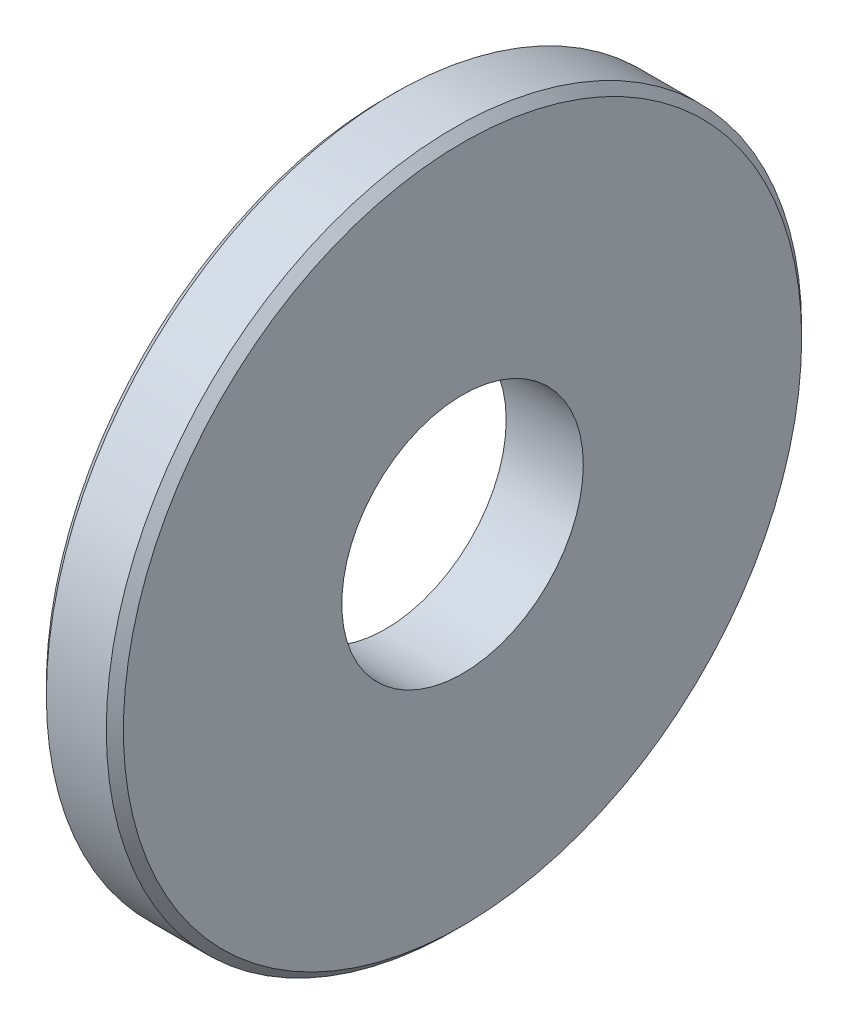
ISO-10303-21;
HEADER;
FILE_DESCRIPTION(('STEP AP214'),'2;1');
FILE_NAME('part.step','',(''),(''),'','','');
FILE_SCHEMA(('AUTOMOTIVE_DESIGN { 1 0 10303 214 1 1 1 1 }'));
ENDSEC;
DATA;
#1=APPLICATION_CONTEXT('core data for automotive mechanical design processes');
#2=APPLICATION_PROTOCOL_DEFINITION('international standard','automotive_design',2000,#1);
#3=PRODUCT_CONTEXT('',#1,'mechanical');
#4=PRODUCT('Part','Part','',(#3));
#5=PRODUCT_RELATED_PRODUCT_CATEGORY('part','',(#4));
#6=PRODUCT_DEFINITION_FORMATION('','',#4);
#7=PRODUCT_DEFINITION_CONTEXT('part definition',#1,'design');
#8=PRODUCT_DEFINITION('design','',#6,#7);
#9=PRODUCT_DEFINITION_SHAPE('','',#8);
#10=(LENGTH_UNIT() NAMED_UNIT(*) SI_UNIT(.MILLI.,.METRE.));
#11=(NAMED_UNIT(*) PLANE_ANGLE_UNIT() SI_UNIT($,.RADIAN.));
#12=(NAMED_UNIT(*) SI_UNIT($,.STERADIAN.) SOLID_ANGLE_UNIT());
#13=UNCERTAINTY_MEASURE_WITH_UNIT(LENGTH_MEASURE(1.E-05),#10,'distance_accuracy_value','');
#14=(GEOMETRIC_REPRESENTATION_CONTEXT(3) GLOBAL_UNCERTAINTY_ASSIGNED_CONTEXT((#13)) GLOBAL_UNIT_ASSIGNED_CONTEXT((#10,
#11,#12)) REPRESENTATION_CONTEXT('',''));
#15=CARTESIAN_POINT('',(0.,0.,0.));
#16=DIRECTION('',(0.,0.,1.));
#17=DIRECTION('',(1.,0.,0.));
#18=AXIS2_PLACEMENT_3D('',#15,#16,#17);
#19=CARTESIAN_POINT('',(1.143,0.,0.));
#20=DIRECTION('',(1.,0.,0.));
#21=DIRECTION('',(0.,0.,-1.));
#22=AXIS2_PLACEMENT_3D('',#19,#20,#21);
#23=PLANE('',#22);
#24=CARTESIAN_POINT('',(1.143,0.,0.));
#25=DIRECTION('',(1.,0.,0.));
#26=DIRECTION('',(0.,0.,-1.));
#27=AXIS2_PLACEMENT_3D('',#24,#25,#26);
#28=CIRCLE('',#27,5.0292);
#29=CARTESIAN_POINT('',(1.143,0.,-5.0292));
#30=VERTEX_POINT('',#29);
#31=EDGE_CURVE('E53',#30,#30,#28,.T.);
#32=ORIENTED_EDGE('',*,*,#31,.T.);
#33=EDGE_LOOP('',(#32));
#34=FACE_BOUND('',#33,.T.);
#35=CARTESIAN_POINT('',(1.143,0.,0.));
#36=DIRECTION('',(1.,0.,0.));
#37=DIRECTION('',(0.,0.,-1.));
#38=AXIS2_PLACEMENT_3D('',#35,#36,#37);
#39=CIRCLE('',#38,1.7907);
#40=CARTESIAN_POINT('',(1.143,0.,-1.7907));
#41=VERTEX_POINT('',#40);
#42=EDGE_CURVE('E58',#41,#41,#39,.T.);
#43=ORIENTED_EDGE('',*,*,#42,.F.);
#44=EDGE_LOOP('',(#43));
#45=FACE_BOUND('',#44,.T.);
#46=ADVANCED_FACE('F37',(#34,#45),#23,.T.);
#47=CARTESIAN_POINT('',(0.,0.,0.));
#48=DIRECTION('',(1.,0.,0.));
#49=DIRECTION('',(0.,0.,-1.));
#50=AXIS2_PLACEMENT_3D('',#47,#48,#49);
#51=PLANE('',#50);
#52=CARTESIAN_POINT('',(0.,0.,0.));
#53=DIRECTION('',(1.,0.,0.));
#54=DIRECTION('',(0.,0.,-1.));
#55=AXIS2_PLACEMENT_3D('',#52,#53,#54);
#56=CIRCLE('',#55,5.0292);
#57=CARTESIAN_POINT('',(0.,0.,-5.0292));
#58=VERTEX_POINT('',#57);
#59=EDGE_CURVE('E10',#58,#58,#56,.F.);
#60=ORIENTED_EDGE('',*,*,#59,.T.);
#61=EDGE_LOOP('',(#60));
#62=FACE_BOUND('',#61,.T.);
#63=CARTESIAN_POINT('',(0.,0.,0.));
#64=DIRECTION('',(1.,0.,0.));
#65=DIRECTION('',(0.,0.,-1.));
#66=AXIS2_PLACEMENT_3D('',#63,#64,#65);
#67=CIRCLE('',#66,1.7907);
#68=CARTESIAN_POINT('',(0.,0.,-1.7907));
#69=VERTEX_POINT('',#68);
#70=EDGE_CURVE('E59',#69,#69,#67,.T.);
#71=ORIENTED_EDGE('',*,*,#70,.T.);
#72=EDGE_LOOP('',(#71));
#73=FACE_BOUND('',#72,.T.);
#74=ADVANCED_FACE('F69',(#62,#73),#51,.F.);
#75=CARTESIAN_POINT('',(1.143,0.,0.));
#76=DIRECTION('',(-1.,0.,0.));
#77=DIRECTION('',(0.,0.,1.));
#78=AXIS2_PLACEMENT_3D('',#75,#76,#77);
#79=CYLINDRICAL_SURFACE('',#78,5.1562);
#80=CARTESIAN_POINT('',(1.016,0.,0.));
#81=DIRECTION('',(1.,0.,0.));
#82=DIRECTION('',(0.,0.,-1.));
#83=AXIS2_PLACEMENT_3D('',#80,#81,#82);
#84=CIRCLE('',#83,5.1562);
#85=CARTESIAN_POINT('',(1.016,0.,-5.1562));
#86=VERTEX_POINT('',#85);
#87=EDGE_CURVE('E45',#86,#86,#84,.F.);
#88=ORIENTED_EDGE('',*,*,#87,.T.);
#89=EDGE_LOOP('',(#88));
#90=FACE_BOUND('',#89,.T.);
#91=CARTESIAN_POINT('',(0.127,0.,0.));
#92=DIRECTION('',(1.,0.,0.));
#93=DIRECTION('',(0.,0.,-1.));
#94=AXIS2_PLACEMENT_3D('',#91,#92,#93);
#95=CIRCLE('',#94,5.1562);
#96=CARTESIAN_POINT('',(0.127,0.,-5.1562));
#97=VERTEX_POINT('',#96);
#98=EDGE_CURVE('E49',#97,#97,#95,.T.);
#99=ORIENTED_EDGE('',*,*,#98,.T.);
#100=EDGE_LOOP('',(#99));
#101=FACE_BOUND('',#100,.T.);
#102=ADVANCED_FACE('F75',(#90,#101),#79,.T.);
#103=CARTESIAN_POINT('',(1.143,0.,0.));
#104=DIRECTION('',(-1.,0.,0.));
#105=DIRECTION('',(0.,0.,1.));
#106=AXIS2_PLACEMENT_3D('',#103,#104,#105);
#107=CYLINDRICAL_SURFACE('',#106,1.7907);
#108=ORIENTED_EDGE('',*,*,#42,.T.);
#109=EDGE_LOOP('',(#108));
#110=FACE_BOUND('',#109,.T.);
#111=ORIENTED_EDGE('',*,*,#70,.F.);
#112=EDGE_LOOP('',(#111));
#113=FACE_BOUND('',#112,.T.);
#114=ADVANCED_FACE('F65',(#110,#113),#107,.F.);
#115=CARTESIAN_POINT('',(1.143,0.,0.));
#116=DIRECTION('',(-1.,0.,0.));
#117=DIRECTION('',(0.,0.,1.));
#118=AXIS2_PLACEMENT_3D('',#115,#116,#117);
#119=CONICAL_SURFACE('',#118,5.0292,0.785398163397435);
#120=ORIENTED_EDGE('',*,*,#87,.F.);
#121=EDGE_LOOP('',(#120));
#122=FACE_BOUND('',#121,.T.);
#123=ORIENTED_EDGE('',*,*,#31,.F.);
#124=EDGE_LOOP('',(#123));
#125=FACE_BOUND('',#124,.T.);
#126=ADVANCED_FACE('F81',(#122,#125),#119,.T.);
#127=CARTESIAN_POINT('',(0.127,0.,0.));
#128=DIRECTION('',(1.,0.,0.));
#129=DIRECTION('',(0.,0.,-1.));
#130=AXIS2_PLACEMENT_3D('',#127,#128,#129);
#131=CONICAL_SURFACE('',#130,5.1562,0.785398163397455);
#132=ORIENTED_EDGE('',*,*,#59,.F.);
#133=EDGE_LOOP('',(#132));
#134=FACE_BOUND('',#133,.T.);
#135=ORIENTED_EDGE('',*,*,#98,.F.);
#136=EDGE_LOOP('',(#135));
#137=FACE_BOUND('',#136,.T.);
#138=ADVANCED_FACE('F40',(#134,#137),#131,.T.);
#139=CLOSED_SHELL('',(#46,#74,#102,#114,#126,#138));
#140=MANIFOLD_SOLID_BREP('B2',#139);
#141=ADVANCED_BREP_SHAPE_REPRESENTATION('',(#18,#140),#14);
#142=SHAPE_DEFINITION_REPRESENTATION(#9,#141);
ENDSEC;
END-ISO-10303-21;
